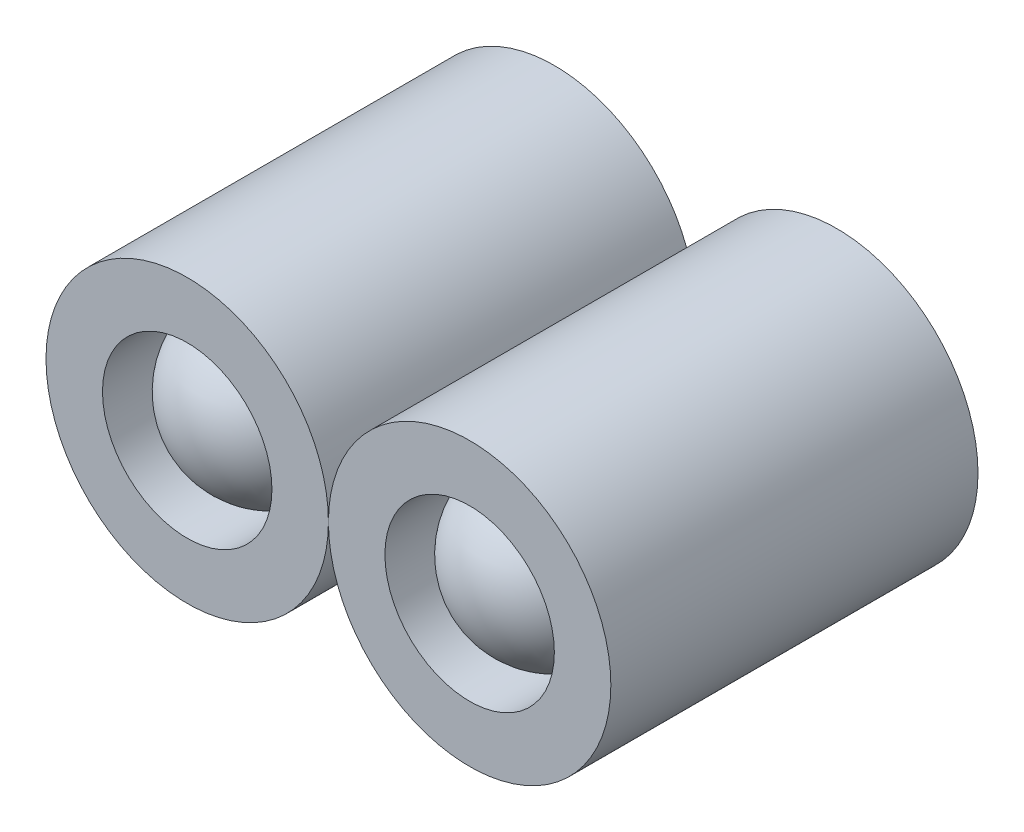
ISO-10303-21;
HEADER;
FILE_DESCRIPTION(('STEP AP214'),'2;1');
FILE_NAME('part.step','',(''),(''),'','','');
FILE_SCHEMA(('AUTOMOTIVE_DESIGN { 1 0 10303 214 1 1 1 1 }'));
ENDSEC;
DATA;
#1=APPLICATION_CONTEXT('core data for automotive mechanical design processes');
#2=APPLICATION_PROTOCOL_DEFINITION('international standard','automotive_design',2000,#1);
#3=PRODUCT_CONTEXT('',#1,'mechanical');
#4=PRODUCT('Part','Part','',(#3));
#5=PRODUCT_RELATED_PRODUCT_CATEGORY('part','',(#4));
#6=PRODUCT_DEFINITION_FORMATION('','',#4);
#7=PRODUCT_DEFINITION_CONTEXT('part definition',#1,'design');
#8=PRODUCT_DEFINITION('design','',#6,#7);
#9=PRODUCT_DEFINITION_SHAPE('','',#8);
#10=(LENGTH_UNIT() NAMED_UNIT(*) SI_UNIT(.MILLI.,.METRE.));
#11=(NAMED_UNIT(*) PLANE_ANGLE_UNIT() SI_UNIT($,.RADIAN.));
#12=(NAMED_UNIT(*) SI_UNIT($,.STERADIAN.) SOLID_ANGLE_UNIT());
#13=UNCERTAINTY_MEASURE_WITH_UNIT(LENGTH_MEASURE(1.E-05),#10,'distance_accuracy_value','');
#14=(GEOMETRIC_REPRESENTATION_CONTEXT(3) GLOBAL_UNCERTAINTY_ASSIGNED_CONTEXT((#13)) GLOBAL_UNIT_ASSIGNED_CONTEXT((#10,
#11,#12)) REPRESENTATION_CONTEXT('',''));
#15=CARTESIAN_POINT('',(0.,0.,0.));
#16=DIRECTION('',(0.,0.,1.));
#17=DIRECTION('',(1.,0.,0.));
#18=AXIS2_PLACEMENT_3D('',#15,#16,#17);
#19=CARTESIAN_POINT('',(-17.4336472084485,17.4496735724289,5.));
#20=DIRECTION('',(0.,1.,0.));
#21=DIRECTION('',(1.,0.,0.));
#22=AXIS2_PLACEMENT_3D('',#19,#20,#21);
#23=SPHERICAL_SURFACE('',#22,1.5);
#24=CARTESIAN_POINT('',(-17.4336472084485,18.9496735724289,5.));
#25=VERTEX_POINT('',#24);
#26=VERTEX_LOOP('',#25);
#27=FACE_BOUND('',#26,.T.);
#28=ADVANCED_FACE('F41',(#27),#23,.T.);
#29=CLOSED_SHELL('',(#28));
#30=MANIFOLD_SOLID_BREP('B2',#29);
#31=CARTESIAN_POINT('',(-22.4336472084485,17.4496735724289,5.));
#32=DIRECTION('',(0.,1.,0.));
#33=DIRECTION('',(1.,0.,0.));
#34=AXIS2_PLACEMENT_3D('',#31,#32,#33);
#35=SPHERICAL_SURFACE('',#34,1.5);
#36=CARTESIAN_POINT('',(-22.4336472084485,18.9496735724289,5.));
#37=VERTEX_POINT('',#36);
#38=VERTEX_LOOP('',#37);
#39=FACE_BOUND('',#38,.T.);
#40=ADVANCED_FACE('F61',(#39),#35,.T.);
#41=CLOSED_SHELL('',(#40));
#42=MANIFOLD_SOLID_BREP('B6',#41);
#43=CARTESIAN_POINT('',(-17.4336472084485,17.4496735724289,6.5));
#44=DIRECTION('',(0.,0.,1.));
#45=DIRECTION('',(1.,0.,0.));
#46=AXIS2_PLACEMENT_3D('',#43,#44,#45);
#47=PLANE('',#46);
#48=CARTESIAN_POINT('',(-17.4336472084485,17.4496735724289,6.5));
#49=DIRECTION('',(0.,0.,1.));
#50=DIRECTION('',(1.,0.,0.));
#51=AXIS2_PLACEMENT_3D('',#48,#49,#50);
#52=CIRCLE('',#51,2.5);
#53=CARTESIAN_POINT('',(-19.9336472084485,17.4496735724289,6.5));
#54=VERTEX_POINT('',#53);
#55=EDGE_CURVE('E89',#54,#54,#52,.T.);
#56=ORIENTED_EDGE('',*,*,#55,.T.);
#57=EDGE_LOOP('',(#56));
#58=FACE_BOUND('',#57,.T.);
#59=CARTESIAN_POINT('',(-17.4336472084485,17.4496735724289,6.5));
#60=DIRECTION('',(0.,0.,1.));
#61=DIRECTION('',(1.,0.,0.));
#62=AXIS2_PLACEMENT_3D('',#59,#60,#61);
#63=CIRCLE('',#62,1.5);
#64=CARTESIAN_POINT('',(-18.9336472084485,17.4496735724289,6.5));
#65=VERTEX_POINT('',#64);
#66=EDGE_CURVE('E98',#65,#65,#63,.T.);
#67=ORIENTED_EDGE('',*,*,#66,.F.);
#68=EDGE_LOOP('',(#67));
#69=FACE_BOUND('',#68,.T.);
#70=ADVANCED_FACE('F82',(#58,#69),#47,.T.);
#71=CARTESIAN_POINT('',(-17.4336472084485,17.4496735724289,0.));
#72=DIRECTION('',(0.,0.,1.));
#73=DIRECTION('',(1.,0.,0.));
#74=AXIS2_PLACEMENT_3D('',#71,#72,#73);
#75=PLANE('',#74);
#76=CARTESIAN_POINT('',(-17.4336472084485,17.4496735724289,0.));
#77=DIRECTION('',(0.,0.,1.));
#78=DIRECTION('',(1.,0.,0.));
#79=AXIS2_PLACEMENT_3D('',#76,#77,#78);
#80=CIRCLE('',#79,2.5);
#81=CARTESIAN_POINT('',(-19.9336472084485,17.4496735724289,0.));
#82=VERTEX_POINT('',#81);
#83=EDGE_CURVE('E93',#82,#82,#80,.T.);
#84=ORIENTED_EDGE('',*,*,#83,.F.);
#85=EDGE_LOOP('',(#84));
#86=FACE_BOUND('',#85,.T.);
#87=ADVANCED_FACE('F106',(#86),#75,.F.);
#88=CARTESIAN_POINT('',(-17.4336472084485,17.4496735724289,6.5));
#89=DIRECTION('',(0.,0.,-1.));
#90=DIRECTION('',(-1.,0.,0.));
#91=AXIS2_PLACEMENT_3D('',#88,#89,#90);
#92=CYLINDRICAL_SURFACE('',#91,2.5);
#93=CARTESIAN_POINT('',(-19.9336472084485,17.4496735724289,6.5));
#94=CARTESIAN_POINT('',(-19.9336472084485,17.4496735724289,6.43229166666667));
#95=CARTESIAN_POINT('',(-19.9336472084485,17.4496735724289,6.36458333333333));
#96=CARTESIAN_POINT('',(-19.9336472084485,17.4496735724289,6.22916666666667));
#97=CARTESIAN_POINT('',(-19.9336472084485,17.4496735724289,6.16145833333333));
#98=CARTESIAN_POINT('',(-19.9336472084485,17.4496735724289,6.02604166666667));
#99=CARTESIAN_POINT('',(-19.9336472084485,17.4496735724289,5.95833333333333));
#100=CARTESIAN_POINT('',(-19.9336472084485,17.4496735724289,5.82291666666667));
#101=CARTESIAN_POINT('',(-19.9336472084485,17.4496735724289,5.75520833333333));
#102=CARTESIAN_POINT('',(-19.9336472084485,17.4496735724289,5.61979166666667));
#103=CARTESIAN_POINT('',(-19.9336472084485,17.4496735724289,5.55208333333333));
#104=CARTESIAN_POINT('',(-19.9336472084485,17.4496735724289,5.41666666666667));
#105=CARTESIAN_POINT('',(-19.9336472084485,17.4496735724289,5.34895833333333));
#106=CARTESIAN_POINT('',(-19.9336472084485,17.4496735724289,5.21354166666667));
#107=CARTESIAN_POINT('',(-19.9336472084485,17.4496735724289,5.14583333333333));
#108=CARTESIAN_POINT('',(-19.9336472084485,17.4496735724289,5.01041666666667));
#109=CARTESIAN_POINT('',(-19.9336472084485,17.4496735724289,4.94270833333333));
#110=CARTESIAN_POINT('',(-19.9336472084485,17.4496735724289,4.80729166666667));
#111=CARTESIAN_POINT('',(-19.9336472084485,17.4496735724289,4.73958333333333));
#112=CARTESIAN_POINT('',(-19.9336472084485,17.4496735724289,4.60416666666667));
#113=CARTESIAN_POINT('',(-19.9336472084485,17.4496735724289,4.53645833333333));
#114=CARTESIAN_POINT('',(-19.9336472084485,17.4496735724289,4.40104166666667));
#115=CARTESIAN_POINT('',(-19.9336472084485,17.4496735724289,4.33333333333333));
#116=CARTESIAN_POINT('',(-19.9336472084485,17.4496735724289,4.19791666666667));
#117=CARTESIAN_POINT('',(-19.9336472084485,17.4496735724289,4.13020833333333));
#118=CARTESIAN_POINT('',(-19.9336472084485,17.4496735724289,3.99479166666667));
#119=CARTESIAN_POINT('',(-19.9336472084485,17.4496735724289,3.92708333333333));
#120=CARTESIAN_POINT('',(-19.9336472084485,17.4496735724289,3.79166666666667));
#121=CARTESIAN_POINT('',(-19.9336472084485,17.4496735724289,3.72395833333333));
#122=CARTESIAN_POINT('',(-19.9336472084485,17.4496735724289,3.58854166666667));
#123=CARTESIAN_POINT('',(-19.9336472084485,17.4496735724289,3.52083333333333));
#124=CARTESIAN_POINT('',(-19.9336472084485,17.4496735724289,3.38541666666667));
#125=CARTESIAN_POINT('',(-19.9336472084485,17.4496735724289,3.31770833333333));
#126=CARTESIAN_POINT('',(-19.9336472084485,17.4496735724289,3.18229166666667));
#127=CARTESIAN_POINT('',(-19.9336472084485,17.4496735724289,3.11458333333333));
#128=CARTESIAN_POINT('',(-19.9336472084485,17.4496735724289,2.97916666666667));
#129=CARTESIAN_POINT('',(-19.9336472084485,17.4496735724289,2.91145833333333));
#130=CARTESIAN_POINT('',(-19.9336472084485,17.4496735724289,2.77604166666667));
#131=CARTESIAN_POINT('',(-19.9336472084485,17.4496735724289,2.70833333333333));
#132=CARTESIAN_POINT('',(-19.9336472084485,17.4496735724289,2.57291666666667));
#133=CARTESIAN_POINT('',(-19.9336472084485,17.4496735724289,2.50520833333333));
#134=CARTESIAN_POINT('',(-19.9336472084485,17.4496735724289,2.36979166666667));
#135=CARTESIAN_POINT('',(-19.9336472084485,17.4496735724289,2.30208333333333));
#136=CARTESIAN_POINT('',(-19.9336472084485,17.4496735724289,2.16666666666667));
#137=CARTESIAN_POINT('',(-19.9336472084485,17.4496735724289,2.09895833333333));
#138=CARTESIAN_POINT('',(-19.9336472084485,17.4496735724289,1.96354166666667));
#139=CARTESIAN_POINT('',(-19.9336472084485,17.4496735724289,1.89583333333333));
#140=CARTESIAN_POINT('',(-19.9336472084485,17.4496735724289,1.76041666666667));
#141=CARTESIAN_POINT('',(-19.9336472084485,17.4496735724289,1.69270833333333));
#142=CARTESIAN_POINT('',(-19.9336472084485,17.4496735724289,1.55729166666667));
#143=CARTESIAN_POINT('',(-19.9336472084485,17.4496735724289,1.48958333333333));
#144=CARTESIAN_POINT('',(-19.9336472084485,17.4496735724289,1.35416666666667));
#145=CARTESIAN_POINT('',(-19.9336472084485,17.4496735724289,1.28645833333333));
#146=CARTESIAN_POINT('',(-19.9336472084485,17.4496735724289,1.15104166666667));
#147=CARTESIAN_POINT('',(-19.9336472084485,17.4496735724289,1.08333333333333));
#148=CARTESIAN_POINT('',(-19.9336472084485,17.4496735724289,0.947916666666667));
#149=CARTESIAN_POINT('',(-19.9336472084485,17.4496735724289,0.880208333333333));
#150=CARTESIAN_POINT('',(-19.9336472084485,17.4496735724289,0.744791666666667));
#151=CARTESIAN_POINT('',(-19.9336472084485,17.4496735724289,0.677083333333333));
#152=CARTESIAN_POINT('',(-19.9336472084485,17.4496735724289,0.541666666666667));
#153=CARTESIAN_POINT('',(-19.9336472084485,17.4496735724289,0.473958333333333));
#154=CARTESIAN_POINT('',(-19.9336472084485,17.4496735724289,0.338541666666667));
#155=CARTESIAN_POINT('',(-19.9336472084485,17.4496735724289,0.270833333333334));
#156=CARTESIAN_POINT('',(-19.9336472084485,17.4496735724289,0.135416666666667));
#157=CARTESIAN_POINT('',(-19.9336472084485,17.4496735724289,0.0677083333333334));
#158=CARTESIAN_POINT('',(-19.9336472084485,17.4496735724289,0.));
#159=B_SPLINE_CURVE_WITH_KNOTS('',3,(#93,#94,#95,#96,#97,#98,#99,#100,#101,#102,#103,#104,#105,
#106,#107,#108,#109,#110,#111,#112,#113,#114,#115,#116,#117,#118,#119,#120,#121,#122,#123,#124,
#125,#126,#127,#128,#129,#130,#131,#132,#133,#134,#135,#136,#137,#138,#139,#140,#141,#142,#143,
#144,#145,#146,#147,#148,#149,#150,#151,#152,#153,#154,#155,#156,#157,#158),.UNSPECIFIED.,.F.,
.F.,(4,2,2,2,2,2,2,2,2,2,2,2,2,2,2,2,2,2,2,2,2,2,2,2,2,2,2,2,2,2,2,2,4),(0.,0.203124999999999,
0.40625,0.609375,0.812499999999999,1.015625,1.21875,1.421875,1.625,1.828125,2.03125,2.234375,
2.4375,2.640625,2.84375,3.046875,3.25,3.453125,3.65625,3.859375,4.0625,4.265625,4.46875,
4.671875,4.875,5.078125,5.28125,5.484375,5.6875,5.890625,6.09375,6.296875,6.5),.UNSPECIFIED.);
#160=EDGE_CURVE('BSEAM84',#54,#82,#159,.T.);
#161=ORIENTED_EDGE('',*,*,#55,.F.);
#162=ORIENTED_EDGE('',*,*,#83,.T.);
#163=ORIENTED_EDGE('',*,*,#160,.T.);
#164=ORIENTED_EDGE('',*,*,#160,.F.);
#165=EDGE_LOOP('',(#161,#163,#162,#164));
#166=FACE_BOUND('',#165,.T.);
#167=ADVANCED_FACE('F84',(#166),#92,.T.);
#168=CARTESIAN_POINT('',(-17.4336472084485,17.4496735724289,6.5));
#169=DIRECTION('',(0.,0.,-1.));
#170=DIRECTION('',(-1.,0.,0.));
#171=AXIS2_PLACEMENT_3D('',#168,#169,#170);
#172=CYLINDRICAL_SURFACE('',#171,1.5);
#173=CARTESIAN_POINT('',(-17.4336472084485,17.4496735724289,5.));
#174=DIRECTION('',(0.,0.,1.));
#175=DIRECTION('',(1.,0.,0.));
#176=AXIS2_PLACEMENT_3D('',#173,#174,#175);
#177=CIRCLE('',#176,1.5);
#178=CARTESIAN_POINT('',(-18.9336472084485,17.4496735724289,5.));
#179=VERTEX_POINT('',#178);
#180=EDGE_CURVE('E60',#179,#179,#177,.T.);
#181=CARTESIAN_POINT('',(-18.9336472084485,17.4496735724289,5.));
#182=CARTESIAN_POINT('',(-18.9336472084485,17.4496735724289,5.015625));
#183=CARTESIAN_POINT('',(-18.9336472084485,17.4496735724289,5.03125));
#184=CARTESIAN_POINT('',(-18.9336472084485,17.4496735724289,5.0625));
#185=CARTESIAN_POINT('',(-18.9336472084485,17.4496735724289,5.078125));
#186=CARTESIAN_POINT('',(-18.9336472084485,17.4496735724289,5.109375));
#187=CARTESIAN_POINT('',(-18.9336472084485,17.4496735724289,5.125));
#188=CARTESIAN_POINT('',(-18.9336472084485,17.4496735724289,5.15625));
#189=CARTESIAN_POINT('',(-18.9336472084485,17.4496735724289,5.171875));
#190=CARTESIAN_POINT('',(-18.9336472084485,17.4496735724289,5.203125));
#191=CARTESIAN_POINT('',(-18.9336472084485,17.4496735724289,5.21875));
#192=CARTESIAN_POINT('',(-18.9336472084485,17.4496735724289,5.25));
#193=CARTESIAN_POINT('',(-18.9336472084485,17.4496735724289,5.265625));
#194=CARTESIAN_POINT('',(-18.9336472084485,17.4496735724289,5.296875));
#195=CARTESIAN_POINT('',(-18.9336472084485,17.4496735724289,5.3125));
#196=CARTESIAN_POINT('',(-18.9336472084485,17.4496735724289,5.34375));
#197=CARTESIAN_POINT('',(-18.9336472084485,17.4496735724289,5.359375));
#198=CARTESIAN_POINT('',(-18.9336472084485,17.4496735724289,5.390625));
#199=CARTESIAN_POINT('',(-18.9336472084485,17.4496735724289,5.40625));
#200=CARTESIAN_POINT('',(-18.9336472084485,17.4496735724289,5.4375));
#201=CARTESIAN_POINT('',(-18.9336472084485,17.4496735724289,5.453125));
#202=CARTESIAN_POINT('',(-18.9336472084485,17.4496735724289,5.484375));
#203=CARTESIAN_POINT('',(-18.9336472084485,17.4496735724289,5.5));
#204=CARTESIAN_POINT('',(-18.9336472084485,17.4496735724289,5.53125));
#205=CARTESIAN_POINT('',(-18.9336472084485,17.4496735724289,5.546875));
#206=CARTESIAN_POINT('',(-18.9336472084485,17.4496735724289,5.578125));
#207=CARTESIAN_POINT('',(-18.9336472084485,17.4496735724289,5.59375));
#208=CARTESIAN_POINT('',(-18.9336472084485,17.4496735724289,5.625));
#209=CARTESIAN_POINT('',(-18.9336472084485,17.4496735724289,5.640625));
#210=CARTESIAN_POINT('',(-18.9336472084485,17.4496735724289,5.671875));
#211=CARTESIAN_POINT('',(-18.9336472084485,17.4496735724289,5.6875));
#212=CARTESIAN_POINT('',(-18.9336472084485,17.4496735724289,5.71875));
#213=CARTESIAN_POINT('',(-18.9336472084485,17.4496735724289,5.734375));
#214=CARTESIAN_POINT('',(-18.9336472084485,17.4496735724289,5.765625));
#215=CARTESIAN_POINT('',(-18.9336472084485,17.4496735724289,5.78125));
#216=CARTESIAN_POINT('',(-18.9336472084485,17.4496735724289,5.8125));
#217=CARTESIAN_POINT('',(-18.9336472084485,17.4496735724289,5.828125));
#218=CARTESIAN_POINT('',(-18.9336472084485,17.4496735724289,5.859375));
#219=CARTESIAN_POINT('',(-18.9336472084485,17.4496735724289,5.875));
#220=CARTESIAN_POINT('',(-18.9336472084485,17.4496735724289,5.90625));
#221=CARTESIAN_POINT('',(-18.9336472084485,17.4496735724289,5.921875));
#222=CARTESIAN_POINT('',(-18.9336472084485,17.4496735724289,5.953125));
#223=CARTESIAN_POINT('',(-18.9336472084485,17.4496735724289,5.96875));
#224=CARTESIAN_POINT('',(-18.9336472084485,17.4496735724289,6.));
#225=CARTESIAN_POINT('',(-18.9336472084485,17.4496735724289,6.015625));
#226=CARTESIAN_POINT('',(-18.9336472084485,17.4496735724289,6.046875));
#227=CARTESIAN_POINT('',(-18.9336472084485,17.4496735724289,6.0625));
#228=CARTESIAN_POINT('',(-18.9336472084485,17.4496735724289,6.09375));
#229=CARTESIAN_POINT('',(-18.9336472084485,17.4496735724289,6.109375));
#230=CARTESIAN_POINT('',(-18.9336472084485,17.4496735724289,6.140625));
#231=CARTESIAN_POINT('',(-18.9336472084485,17.4496735724289,6.15625));
#232=CARTESIAN_POINT('',(-18.9336472084485,17.4496735724289,6.1875));
#233=CARTESIAN_POINT('',(-18.9336472084485,17.4496735724289,6.203125));
#234=CARTESIAN_POINT('',(-18.9336472084485,17.4496735724289,6.234375));
#235=CARTESIAN_POINT('',(-18.9336472084485,17.4496735724289,6.25));
#236=CARTESIAN_POINT('',(-18.9336472084485,17.4496735724289,6.28125));
#237=CARTESIAN_POINT('',(-18.9336472084485,17.4496735724289,6.296875));
#238=CARTESIAN_POINT('',(-18.9336472084485,17.4496735724289,6.328125));
#239=CARTESIAN_POINT('',(-18.9336472084485,17.4496735724289,6.34375));
#240=CARTESIAN_POINT('',(-18.9336472084485,17.4496735724289,6.375));
#241=CARTESIAN_POINT('',(-18.9336472084485,17.4496735724289,6.390625));
#242=CARTESIAN_POINT('',(-18.9336472084485,17.4496735724289,6.421875));
#243=CARTESIAN_POINT('',(-18.9336472084485,17.4496735724289,6.4375));
#244=CARTESIAN_POINT('',(-18.9336472084485,17.4496735724289,6.46875));
#245=CARTESIAN_POINT('',(-18.9336472084485,17.4496735724289,6.484375));
#246=CARTESIAN_POINT('',(-18.9336472084485,17.4496735724289,6.5));
#247=B_SPLINE_CURVE_WITH_KNOTS('',3,(#181,#182,#183,#184,#185,#186,#187,#188,#189,#190,#191,
#192,#193,#194,#195,#196,#197,#198,#199,#200,#201,#202,#203,#204,#205,#206,#207,#208,#209,#210,
#211,#212,#213,#214,#215,#216,#217,#218,#219,#220,#221,#222,#223,#224,#225,#226,#227,#228,#229,
#230,#231,#232,#233,#234,#235,#236,#237,#238,#239,#240,#241,#242,#243,#244,#245,#246),
.UNSPECIFIED.,.F.,.F.,(4,2,2,2,2,2,2,2,2,2,2,2,2,2,2,2,2,2,2,2,2,2,2,2,2,2,2,2,2,2,2,2,4),(0.,
0.046875,0.0937500000000001,0.140624999999999,0.187499999999999,0.234374999999999,
0.281249999999999,0.328124999999999,0.374999999999999,0.421875,0.46875,0.515625,0.5625,0.609375,
0.65625,0.703125,0.75,0.796875,0.84375,0.890624999999999,0.937499999999999,0.984374999999999,
1.03125,1.078125,1.125,1.171875,1.21875,1.265625,1.3125,1.359375,1.40625,1.453125,1.5),.UNSPECIFIED.);
#248=EDGE_CURVE('BSEAM103',#179,#65,#247,.T.);
#249=ORIENTED_EDGE('',*,*,#180,.F.);
#250=ORIENTED_EDGE('',*,*,#66,.T.);
#251=ORIENTED_EDGE('',*,*,#248,.T.);
#252=ORIENTED_EDGE('',*,*,#248,.F.);
#253=EDGE_LOOP('',(#249,#251,#250,#252));
#254=FACE_BOUND('',#253,.T.);
#255=ADVANCED_FACE('F103',(#254),#172,.F.);
#256=CARTESIAN_POINT('',(-17.4336472084485,17.4496735724289,5.));
#257=DIRECTION('',(0.,0.,1.));
#258=DIRECTION('',(1.,0.,0.));
#259=AXIS2_PLACEMENT_3D('',#256,#257,#258);
#260=PLANE('',#259);
#261=ORIENTED_EDGE('',*,*,#180,.T.);
#262=EDGE_LOOP('',(#261));
#263=FACE_BOUND('',#262,.T.);
#264=ADVANCED_FACE('F115',(#263),#260,.T.);
#265=CLOSED_SHELL('',(#70,#87,#167,#255,#264));
#266=MANIFOLD_SOLID_BREP('B37',#265);
#267=CARTESIAN_POINT('',(-22.4336472084485,17.4496735724289,6.5));
#268=DIRECTION('',(0.,0.,1.));
#269=DIRECTION('',(1.,0.,0.));
#270=AXIS2_PLACEMENT_3D('',#267,#268,#269);
#271=PLANE('',#270);
#272=CARTESIAN_POINT('',(-22.4336472084485,17.4496735724289,6.5));
#273=DIRECTION('',(0.,0.,1.));
#274=DIRECTION('',(1.,0.,0.));
#275=AXIS2_PLACEMENT_3D('',#272,#273,#274);
#276=CIRCLE('',#275,2.5);
#277=CARTESIAN_POINT('',(-24.9336472084485,17.4496735724289,6.5));
#278=VERTEX_POINT('',#277);
#279=EDGE_CURVE('E162',#278,#278,#276,.T.);
#280=ORIENTED_EDGE('',*,*,#279,.T.);
#281=EDGE_LOOP('',(#280));
#282=FACE_BOUND('',#281,.T.);
#283=CARTESIAN_POINT('',(-22.4336472084485,17.4496735724289,6.5));
#284=DIRECTION('',(0.,0.,1.));
#285=DIRECTION('',(1.,0.,0.));
#286=AXIS2_PLACEMENT_3D('',#283,#284,#285);
#287=CIRCLE('',#286,1.5);
#288=CARTESIAN_POINT('',(-23.9336472084485,17.4496735724289,6.5));
#289=VERTEX_POINT('',#288);
#290=EDGE_CURVE('E171',#289,#289,#287,.T.);
#291=ORIENTED_EDGE('',*,*,#290,.F.);
#292=EDGE_LOOP('',(#291));
#293=FACE_BOUND('',#292,.T.);
#294=ADVANCED_FACE('F155',(#282,#293),#271,.T.);
#295=CARTESIAN_POINT('',(-22.4336472084485,17.4496735724289,0.));
#296=DIRECTION('',(0.,0.,1.));
#297=DIRECTION('',(1.,0.,0.));
#298=AXIS2_PLACEMENT_3D('',#295,#296,#297);
#299=PLANE('',#298);
#300=CARTESIAN_POINT('',(-22.4336472084485,17.4496735724289,0.));
#301=DIRECTION('',(0.,0.,1.));
#302=DIRECTION('',(1.,0.,0.));
#303=AXIS2_PLACEMENT_3D('',#300,#301,#302);
#304=CIRCLE('',#303,2.5);
#305=CARTESIAN_POINT('',(-24.9336472084485,17.4496735724289,0.));
#306=VERTEX_POINT('',#305);
#307=EDGE_CURVE('E166',#306,#306,#304,.T.);
#308=ORIENTED_EDGE('',*,*,#307,.F.);
#309=EDGE_LOOP('',(#308));
#310=FACE_BOUND('',#309,.T.);
#311=ADVANCED_FACE('F179',(#310),#299,.F.);
#312=CARTESIAN_POINT('',(-22.4336472084485,17.4496735724289,6.5));
#313=DIRECTION('',(0.,0.,-1.));
#314=DIRECTION('',(-1.,0.,0.));
#315=AXIS2_PLACEMENT_3D('',#312,#313,#314);
#316=CYLINDRICAL_SURFACE('',#315,2.5);
#317=CARTESIAN_POINT('',(-24.9336472084485,17.4496735724289,0.));
#318=CARTESIAN_POINT('',(-24.9336472084485,17.4496735724289,0.0677083333333334));
#319=CARTESIAN_POINT('',(-24.9336472084485,17.4496735724289,0.135416666666667));
#320=CARTESIAN_POINT('',(-24.9336472084485,17.4496735724289,0.270833333333334));
#321=CARTESIAN_POINT('',(-24.9336472084485,17.4496735724289,0.338541666666667));
#322=CARTESIAN_POINT('',(-24.9336472084485,17.4496735724289,0.473958333333333));
#323=CARTESIAN_POINT('',(-24.9336472084485,17.4496735724289,0.541666666666667));
#324=CARTESIAN_POINT('',(-24.9336472084485,17.4496735724289,0.677083333333333));
#325=CARTESIAN_POINT('',(-24.9336472084485,17.4496735724289,0.744791666666667));
#326=CARTESIAN_POINT('',(-24.9336472084485,17.4496735724289,0.880208333333333));
#327=CARTESIAN_POINT('',(-24.9336472084485,17.4496735724289,0.947916666666667));
#328=CARTESIAN_POINT('',(-24.9336472084485,17.4496735724289,1.08333333333333));
#329=CARTESIAN_POINT('',(-24.9336472084485,17.4496735724289,1.15104166666667));
#330=CARTESIAN_POINT('',(-24.9336472084485,17.4496735724289,1.28645833333333));
#331=CARTESIAN_POINT('',(-24.9336472084485,17.4496735724289,1.35416666666667));
#332=CARTESIAN_POINT('',(-24.9336472084485,17.4496735724289,1.48958333333333));
#333=CARTESIAN_POINT('',(-24.9336472084485,17.4496735724289,1.55729166666667));
#334=CARTESIAN_POINT('',(-24.9336472084485,17.4496735724289,1.69270833333333));
#335=CARTESIAN_POINT('',(-24.9336472084485,17.4496735724289,1.76041666666667));
#336=CARTESIAN_POINT('',(-24.9336472084485,17.4496735724289,1.89583333333333));
#337=CARTESIAN_POINT('',(-24.9336472084485,17.4496735724289,1.96354166666667));
#338=CARTESIAN_POINT('',(-24.9336472084485,17.4496735724289,2.09895833333333));
#339=CARTESIAN_POINT('',(-24.9336472084485,17.4496735724289,2.16666666666667));
#340=CARTESIAN_POINT('',(-24.9336472084485,17.4496735724289,2.30208333333333));
#341=CARTESIAN_POINT('',(-24.9336472084485,17.4496735724289,2.36979166666667));
#342=CARTESIAN_POINT('',(-24.9336472084485,17.4496735724289,2.50520833333333));
#343=CARTESIAN_POINT('',(-24.9336472084485,17.4496735724289,2.57291666666667));
#344=CARTESIAN_POINT('',(-24.9336472084485,17.4496735724289,2.70833333333333));
#345=CARTESIAN_POINT('',(-24.9336472084485,17.4496735724289,2.77604166666667));
#346=CARTESIAN_POINT('',(-24.9336472084485,17.4496735724289,2.91145833333333));
#347=CARTESIAN_POINT('',(-24.9336472084485,17.4496735724289,2.97916666666667));
#348=CARTESIAN_POINT('',(-24.9336472084485,17.4496735724289,3.11458333333333));
#349=CARTESIAN_POINT('',(-24.9336472084485,17.4496735724289,3.18229166666667));
#350=CARTESIAN_POINT('',(-24.9336472084485,17.4496735724289,3.31770833333333));
#351=CARTESIAN_POINT('',(-24.9336472084485,17.4496735724289,3.38541666666667));
#352=CARTESIAN_POINT('',(-24.9336472084485,17.4496735724289,3.52083333333333));
#353=CARTESIAN_POINT('',(-24.9336472084485,17.4496735724289,3.58854166666667));
#354=CARTESIAN_POINT('',(-24.9336472084485,17.4496735724289,3.72395833333333));
#355=CARTESIAN_POINT('',(-24.9336472084485,17.4496735724289,3.79166666666667));
#356=CARTESIAN_POINT('',(-24.9336472084485,17.4496735724289,3.92708333333333));
#357=CARTESIAN_POINT('',(-24.9336472084485,17.4496735724289,3.99479166666667));
#358=CARTESIAN_POINT('',(-24.9336472084485,17.4496735724289,4.13020833333333));
#359=CARTESIAN_POINT('',(-24.9336472084485,17.4496735724289,4.19791666666667));
#360=CARTESIAN_POINT('',(-24.9336472084485,17.4496735724289,4.33333333333333));
#361=CARTESIAN_POINT('',(-24.9336472084485,17.4496735724289,4.40104166666667));
#362=CARTESIAN_POINT('',(-24.9336472084485,17.4496735724289,4.53645833333333));
#363=CARTESIAN_POINT('',(-24.9336472084485,17.4496735724289,4.60416666666667));
#364=CARTESIAN_POINT('',(-24.9336472084485,17.4496735724289,4.73958333333333));
#365=CARTESIAN_POINT('',(-24.9336472084485,17.4496735724289,4.80729166666667));
#366=CARTESIAN_POINT('',(-24.9336472084485,17.4496735724289,4.94270833333333));
#367=CARTESIAN_POINT('',(-24.9336472084485,17.4496735724289,5.01041666666667));
#368=CARTESIAN_POINT('',(-24.9336472084485,17.4496735724289,5.14583333333333));
#369=CARTESIAN_POINT('',(-24.9336472084485,17.4496735724289,5.21354166666667));
#370=CARTESIAN_POINT('',(-24.9336472084485,17.4496735724289,5.34895833333333));
#371=CARTESIAN_POINT('',(-24.9336472084485,17.4496735724289,5.41666666666667));
#372=CARTESIAN_POINT('',(-24.9336472084485,17.4496735724289,5.55208333333333));
#373=CARTESIAN_POINT('',(-24.9336472084485,17.4496735724289,5.61979166666667));
#374=CARTESIAN_POINT('',(-24.9336472084485,17.4496735724289,5.75520833333333));
#375=CARTESIAN_POINT('',(-24.9336472084485,17.4496735724289,5.82291666666667));
#376=CARTESIAN_POINT('',(-24.9336472084485,17.4496735724289,5.95833333333333));
#377=CARTESIAN_POINT('',(-24.9336472084485,17.4496735724289,6.02604166666667));
#378=CARTESIAN_POINT('',(-24.9336472084485,17.4496735724289,6.16145833333333));
#379=CARTESIAN_POINT('',(-24.9336472084485,17.4496735724289,6.22916666666667));
#380=CARTESIAN_POINT('',(-24.9336472084485,17.4496735724289,6.36458333333333));
#381=CARTESIAN_POINT('',(-24.9336472084485,17.4496735724289,6.43229166666667));
#382=CARTESIAN_POINT('',(-24.9336472084485,17.4496735724289,6.5));
#383=B_SPLINE_CURVE_WITH_KNOTS('',3,(#317,#318,#319,#320,#321,#322,#323,#324,#325,#326,#327,
#328,#329,#330,#331,#332,#333,#334,#335,#336,#337,#338,#339,#340,#341,#342,#343,#344,#345,#346,
#347,#348,#349,#350,#351,#352,#353,#354,#355,#356,#357,#358,#359,#360,#361,#362,#363,#364,#365,
#366,#367,#368,#369,#370,#371,#372,#373,#374,#375,#376,#377,#378,#379,#380,#381,#382),
.UNSPECIFIED.,.F.,.F.,(4,2,2,2,2,2,2,2,2,2,2,2,2,2,2,2,2,2,2,2,2,2,2,2,2,2,2,2,2,2,2,2,4),(0.,
0.203125,0.40625,0.609375,0.8125,1.015625,1.21875,1.421875,1.625,1.828125,2.03125,2.234375,
2.4375,2.640625,2.84375,3.046875,3.25,3.453125,3.65625,3.859375,4.0625,4.265625,4.46875,
4.671875,4.875,5.078125,5.28125,5.484375,5.6875,5.890625,6.09375,6.296875,6.5),.UNSPECIFIED.);
#384=EDGE_CURVE('BSEAM157',#306,#278,#383,.T.);
#385=ORIENTED_EDGE('',*,*,#307,.T.);
#386=ORIENTED_EDGE('',*,*,#279,.F.);
#387=ORIENTED_EDGE('',*,*,#384,.T.);
#388=ORIENTED_EDGE('',*,*,#384,.F.);
#389=EDGE_LOOP('',(#385,#387,#386,#388));
#390=FACE_BOUND('',#389,.T.);
#391=ADVANCED_FACE('F157',(#390),#316,.T.);
#392=CARTESIAN_POINT('',(-22.4336472084485,17.4496735724289,6.5));
#393=DIRECTION('',(0.,0.,-1.));
#394=DIRECTION('',(-1.,0.,0.));
#395=AXIS2_PLACEMENT_3D('',#392,#393,#394);
#396=CYLINDRICAL_SURFACE('',#395,1.5);
#397=CARTESIAN_POINT('',(-22.4336472084485,17.4496735724289,5.));
#398=DIRECTION('',(0.,0.,1.));
#399=DIRECTION('',(1.,0.,0.));
#400=AXIS2_PLACEMENT_3D('',#397,#398,#399);
#401=CIRCLE('',#400,1.5);
#402=CARTESIAN_POINT('',(-23.9336472084485,17.4496735724289,5.));
#403=VERTEX_POINT('',#402);
#404=EDGE_CURVE('E81',#403,#403,#401,.T.);
#405=CARTESIAN_POINT('',(-23.9336472084485,17.4496735724289,5.));
#406=CARTESIAN_POINT('',(-23.9336472084485,17.4496735724289,5.015625));
#407=CARTESIAN_POINT('',(-23.9336472084485,17.4496735724289,5.03125));
#408=CARTESIAN_POINT('',(-23.9336472084485,17.4496735724289,5.0625));
#409=CARTESIAN_POINT('',(-23.9336472084485,17.4496735724289,5.078125));
#410=CARTESIAN_POINT('',(-23.9336472084485,17.4496735724289,5.109375));
#411=CARTESIAN_POINT('',(-23.9336472084485,17.4496735724289,5.125));
#412=CARTESIAN_POINT('',(-23.9336472084485,17.4496735724289,5.15625));
#413=CARTESIAN_POINT('',(-23.9336472084485,17.4496735724289,5.171875));
#414=CARTESIAN_POINT('',(-23.9336472084485,17.4496735724289,5.203125));
#415=CARTESIAN_POINT('',(-23.9336472084485,17.4496735724289,5.21875));
#416=CARTESIAN_POINT('',(-23.9336472084485,17.4496735724289,5.25));
#417=CARTESIAN_POINT('',(-23.9336472084485,17.4496735724289,5.265625));
#418=CARTESIAN_POINT('',(-23.9336472084485,17.4496735724289,5.296875));
#419=CARTESIAN_POINT('',(-23.9336472084485,17.4496735724289,5.3125));
#420=CARTESIAN_POINT('',(-23.9336472084485,17.4496735724289,5.34375));
#421=CARTESIAN_POINT('',(-23.9336472084485,17.4496735724289,5.359375));
#422=CARTESIAN_POINT('',(-23.9336472084485,17.4496735724289,5.390625));
#423=CARTESIAN_POINT('',(-23.9336472084485,17.4496735724289,5.40625));
#424=CARTESIAN_POINT('',(-23.9336472084485,17.4496735724289,5.4375));
#425=CARTESIAN_POINT('',(-23.9336472084485,17.4496735724289,5.453125));
#426=CARTESIAN_POINT('',(-23.9336472084485,17.4496735724289,5.484375));
#427=CARTESIAN_POINT('',(-23.9336472084485,17.4496735724289,5.5));
#428=CARTESIAN_POINT('',(-23.9336472084485,17.4496735724289,5.53125));
#429=CARTESIAN_POINT('',(-23.9336472084485,17.4496735724289,5.546875));
#430=CARTESIAN_POINT('',(-23.9336472084485,17.4496735724289,5.578125));
#431=CARTESIAN_POINT('',(-23.9336472084485,17.4496735724289,5.59375));
#432=CARTESIAN_POINT('',(-23.9336472084485,17.4496735724289,5.625));
#433=CARTESIAN_POINT('',(-23.9336472084485,17.4496735724289,5.640625));
#434=CARTESIAN_POINT('',(-23.9336472084485,17.4496735724289,5.671875));
#435=CARTESIAN_POINT('',(-23.9336472084485,17.4496735724289,5.6875));
#436=CARTESIAN_POINT('',(-23.9336472084485,17.4496735724289,5.71875));
#437=CARTESIAN_POINT('',(-23.9336472084485,17.4496735724289,5.734375));
#438=CARTESIAN_POINT('',(-23.9336472084485,17.4496735724289,5.765625));
#439=CARTESIAN_POINT('',(-23.9336472084485,17.4496735724289,5.78125));
#440=CARTESIAN_POINT('',(-23.9336472084485,17.4496735724289,5.8125));
#441=CARTESIAN_POINT('',(-23.9336472084485,17.4496735724289,5.828125));
#442=CARTESIAN_POINT('',(-23.9336472084485,17.4496735724289,5.859375));
#443=CARTESIAN_POINT('',(-23.9336472084485,17.4496735724289,5.875));
#444=CARTESIAN_POINT('',(-23.9336472084485,17.4496735724289,5.90625));
#445=CARTESIAN_POINT('',(-23.9336472084485,17.4496735724289,5.921875));
#446=CARTESIAN_POINT('',(-23.9336472084485,17.4496735724289,5.953125));
#447=CARTESIAN_POINT('',(-23.9336472084485,17.4496735724289,5.96875));
#448=CARTESIAN_POINT('',(-23.9336472084485,17.4496735724289,6.));
#449=CARTESIAN_POINT('',(-23.9336472084485,17.4496735724289,6.015625));
#450=CARTESIAN_POINT('',(-23.9336472084485,17.4496735724289,6.046875));
#451=CARTESIAN_POINT('',(-23.9336472084485,17.4496735724289,6.0625));
#452=CARTESIAN_POINT('',(-23.9336472084485,17.4496735724289,6.09375));
#453=CARTESIAN_POINT('',(-23.9336472084485,17.4496735724289,6.109375));
#454=CARTESIAN_POINT('',(-23.9336472084485,17.4496735724289,6.140625));
#455=CARTESIAN_POINT('',(-23.9336472084485,17.4496735724289,6.15625));
#456=CARTESIAN_POINT('',(-23.9336472084485,17.4496735724289,6.1875));
#457=CARTESIAN_POINT('',(-23.9336472084485,17.4496735724289,6.203125));
#458=CARTESIAN_POINT('',(-23.9336472084485,17.4496735724289,6.234375));
#459=CARTESIAN_POINT('',(-23.9336472084485,17.4496735724289,6.25));
#460=CARTESIAN_POINT('',(-23.9336472084485,17.4496735724289,6.28125));
#461=CARTESIAN_POINT('',(-23.9336472084485,17.4496735724289,6.296875));
#462=CARTESIAN_POINT('',(-23.9336472084485,17.4496735724289,6.328125));
#463=CARTESIAN_POINT('',(-23.9336472084485,17.4496735724289,6.34375));
#464=CARTESIAN_POINT('',(-23.9336472084485,17.4496735724289,6.375));
#465=CARTESIAN_POINT('',(-23.9336472084485,17.4496735724289,6.390625));
#466=CARTESIAN_POINT('',(-23.9336472084485,17.4496735724289,6.421875));
#467=CARTESIAN_POINT('',(-23.9336472084485,17.4496735724289,6.4375));
#468=CARTESIAN_POINT('',(-23.9336472084485,17.4496735724289,6.46875));
#469=CARTESIAN_POINT('',(-23.9336472084485,17.4496735724289,6.484375));
#470=CARTESIAN_POINT('',(-23.9336472084485,17.4496735724289,6.5));
#471=B_SPLINE_CURVE_WITH_KNOTS('',3,(#405,#406,#407,#408,#409,#410,#411,#412,#413,#414,#415,
#416,#417,#418,#419,#420,#421,#422,#423,#424,#425,#426,#427,#428,#429,#430,#431,#432,#433,#434,
#435,#436,#437,#438,#439,#440,#441,#442,#443,#444,#445,#446,#447,#448,#449,#450,#451,#452,#453,
#454,#455,#456,#457,#458,#459,#460,#461,#462,#463,#464,#465,#466,#467,#468,#469,#470),
.UNSPECIFIED.,.F.,.F.,(4,2,2,2,2,2,2,2,2,2,2,2,2,2,2,2,2,2,2,2,2,2,2,2,2,2,2,2,2,2,2,2,4),(0.,
0.046875,0.0937500000000001,0.140624999999999,0.187499999999999,0.234374999999999,
0.281249999999999,0.328124999999999,0.374999999999999,0.421875,0.46875,0.515625,0.5625,0.609375,
0.65625,0.703125,0.75,0.796875,0.84375,0.890624999999999,0.937499999999999,0.984374999999999,
1.03125,1.078125,1.125,1.171875,1.21875,1.265625,1.3125,1.359375,1.40625,1.453125,1.5),.UNSPECIFIED.);
#472=EDGE_CURVE('BSEAM176',#403,#289,#471,.T.);
#473=ORIENTED_EDGE('',*,*,#404,.F.);
#474=ORIENTED_EDGE('',*,*,#290,.T.);
#475=ORIENTED_EDGE('',*,*,#472,.T.);
#476=ORIENTED_EDGE('',*,*,#472,.F.);
#477=EDGE_LOOP('',(#473,#475,#474,#476));
#478=FACE_BOUND('',#477,.T.);
#479=ADVANCED_FACE('F176',(#478),#396,.F.);
#480=CARTESIAN_POINT('',(-22.4336472084485,17.4496735724289,5.));
#481=DIRECTION('',(0.,0.,1.));
#482=DIRECTION('',(1.,0.,0.));
#483=AXIS2_PLACEMENT_3D('',#480,#481,#482);
#484=PLANE('',#483);
#485=ORIENTED_EDGE('',*,*,#404,.T.);
#486=EDGE_LOOP('',(#485));
#487=FACE_BOUND('',#486,.T.);
#488=ADVANCED_FACE('F188',(#487),#484,.T.);
#489=CLOSED_SHELL('',(#294,#311,#391,#479,#488));
#490=MANIFOLD_SOLID_BREP('B55',#489);
#491=ADVANCED_BREP_SHAPE_REPRESENTATION('',(#18,#30,#42,#266,#490),#14);
#492=SHAPE_DEFINITION_REPRESENTATION(#9,#491);
ENDSEC;
END-ISO-10303-21;
